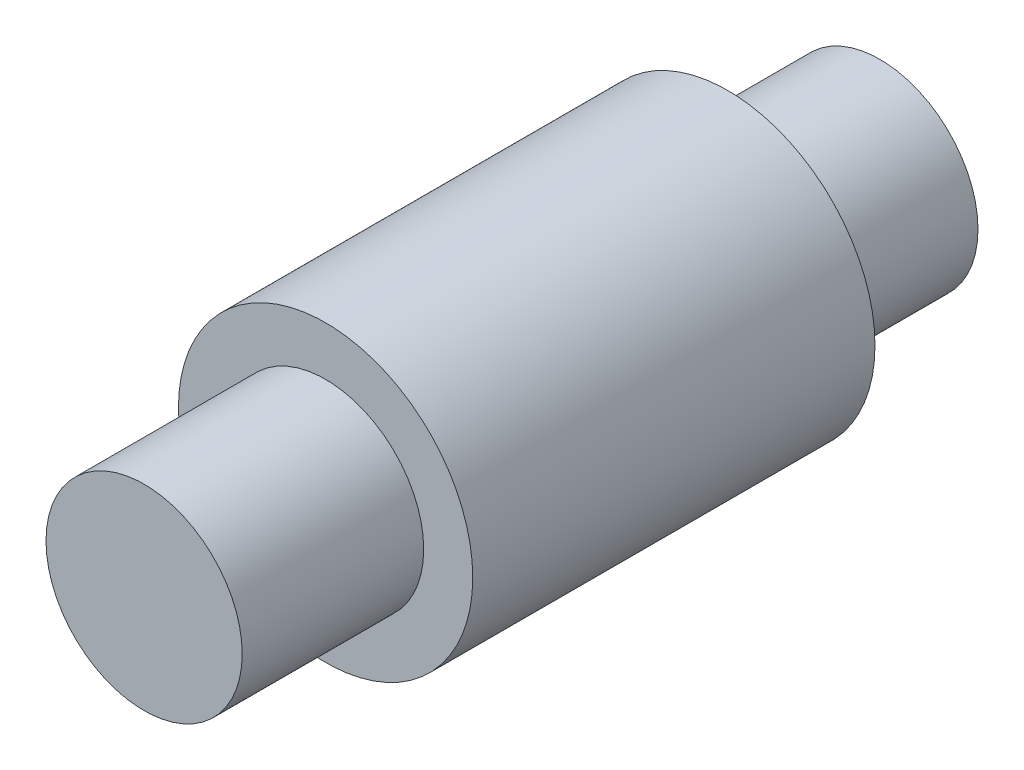
ISO-10303-21;
HEADER;
FILE_DESCRIPTION(('STEP AP214'),'2;1');
FILE_NAME('part.step','',(''),(''),'','','');
FILE_SCHEMA(('AUTOMOTIVE_DESIGN { 1 0 10303 214 1 1 1 1 }'));
ENDSEC;
DATA;
#1=APPLICATION_CONTEXT('core data for automotive mechanical design processes');
#2=APPLICATION_PROTOCOL_DEFINITION('international standard','automotive_design',2000,#1);
#3=PRODUCT_CONTEXT('',#1,'mechanical');
#4=PRODUCT('Part','Part','',(#3));
#5=PRODUCT_RELATED_PRODUCT_CATEGORY('part','',(#4));
#6=PRODUCT_DEFINITION_FORMATION('','',#4);
#7=PRODUCT_DEFINITION_CONTEXT('part definition',#1,'design');
#8=PRODUCT_DEFINITION('design','',#6,#7);
#9=PRODUCT_DEFINITION_SHAPE('','',#8);
#10=(LENGTH_UNIT() NAMED_UNIT(*) SI_UNIT(.MILLI.,.METRE.));
#11=(NAMED_UNIT(*) PLANE_ANGLE_UNIT() SI_UNIT($,.RADIAN.));
#12=(NAMED_UNIT(*) SI_UNIT($,.STERADIAN.) SOLID_ANGLE_UNIT());
#13=UNCERTAINTY_MEASURE_WITH_UNIT(LENGTH_MEASURE(1.E-05),#10,'distance_accuracy_value','');
#14=(GEOMETRIC_REPRESENTATION_CONTEXT(3) GLOBAL_UNCERTAINTY_ASSIGNED_CONTEXT((#13)) GLOBAL_UNIT_ASSIGNED_CONTEXT((#10,
#11,#12)) REPRESENTATION_CONTEXT('',''));
#15=CARTESIAN_POINT('',(0.,0.,0.));
#16=DIRECTION('',(0.,0.,1.));
#17=DIRECTION('',(1.,0.,0.));
#18=AXIS2_PLACEMENT_3D('',#15,#16,#17);
#19=CARTESIAN_POINT('',(0.,0.,41.));
#20=DIRECTION('',(0.,0.,-1.));
#21=DIRECTION('',(-1.,0.,0.));
#22=AXIS2_PLACEMENT_3D('',#19,#20,#21);
#23=CYLINDRICAL_SURFACE('',#22,15.);
#24=CARTESIAN_POINT('',(0.,0.,41.));
#25=DIRECTION('',(0.,0.,1.));
#26=DIRECTION('',(1.,0.,0.));
#27=AXIS2_PLACEMENT_3D('',#24,#25,#26);
#28=CIRCLE('',#27,15.);
#29=CARTESIAN_POINT('',(15.,0.,41.));
#30=VERTEX_POINT('',#29);
#31=EDGE_CURVE('E44',#30,#30,#28,.T.);
#32=ORIENTED_EDGE('',*,*,#31,.F.);
#33=EDGE_LOOP('',(#32));
#34=FACE_BOUND('',#33,.T.);
#35=CARTESIAN_POINT('',(0.,0.,0.));
#36=DIRECTION('',(0.,0.,1.));
#37=DIRECTION('',(1.,0.,0.));
#38=AXIS2_PLACEMENT_3D('',#35,#36,#37);
#39=CIRCLE('',#38,15.);
#40=CARTESIAN_POINT('',(15.,0.,0.));
#41=VERTEX_POINT('',#40);
#42=EDGE_CURVE('E35',#41,#41,#39,.T.);
#43=ORIENTED_EDGE('',*,*,#42,.T.);
#44=EDGE_LOOP('',(#43));
#45=FACE_BOUND('',#44,.T.);
#46=ADVANCED_FACE('F32',(#34,#45),#23,.T.);
#47=CARTESIAN_POINT('',(0.,0.,41.));
#48=DIRECTION('',(0.,0.,1.));
#49=DIRECTION('',(1.,0.,0.));
#50=AXIS2_PLACEMENT_3D('',#47,#48,#49);
#51=PLANE('',#50);
#52=CARTESIAN_POINT('',(0.,0.,41.));
#53=DIRECTION('',(0.,0.,1.));
#54=DIRECTION('',(1.,0.,0.));
#55=AXIS2_PLACEMENT_3D('',#52,#53,#54);
#56=CIRCLE('',#55,10.);
#57=CARTESIAN_POINT('',(10.,0.,41.));
#58=VERTEX_POINT('',#57);
#59=EDGE_CURVE('E39',#58,#58,#56,.T.);
#60=ORIENTED_EDGE('',*,*,#59,.F.);
#61=EDGE_LOOP('',(#60));
#62=FACE_BOUND('',#61,.T.);
#63=ORIENTED_EDGE('',*,*,#31,.T.);
#64=EDGE_LOOP('',(#63));
#65=FACE_BOUND('',#64,.T.);
#66=ADVANCED_FACE('F78',(#62,#65),#51,.T.);
#67=CARTESIAN_POINT('',(0.,0.,0.));
#68=DIRECTION('',(0.,0.,1.));
#69=DIRECTION('',(1.,0.,0.));
#70=AXIS2_PLACEMENT_3D('',#67,#68,#69);
#71=PLANE('',#70);
#72=CARTESIAN_POINT('',(0.,0.,0.));
#73=DIRECTION('',(0.,0.,-1.));
#74=DIRECTION('',(-1.,0.,0.));
#75=AXIS2_PLACEMENT_3D('',#72,#73,#74);
#76=CIRCLE('',#75,10.);
#77=CARTESIAN_POINT('',(-10.,0.,0.));
#78=VERTEX_POINT('',#77);
#79=EDGE_CURVE('E10',#78,#78,#76,.T.);
#80=ORIENTED_EDGE('',*,*,#79,.F.);
#81=EDGE_LOOP('',(#80));
#82=FACE_BOUND('',#81,.T.);
#83=ORIENTED_EDGE('',*,*,#42,.F.);
#84=EDGE_LOOP('',(#83));
#85=FACE_BOUND('',#84,.T.);
#86=ADVANCED_FACE('F74',(#82,#85),#71,.F.);
#87=CARTESIAN_POINT('',(0.,0.,49.5));
#88=DIRECTION('',(0.,0.,-1.));
#89=DIRECTION('',(-1.,0.,0.));
#90=AXIS2_PLACEMENT_3D('',#87,#88,#89);
#91=CYLINDRICAL_SURFACE('',#90,10.);
#92=ORIENTED_EDGE('',*,*,#59,.T.);
#93=EDGE_LOOP('',(#92));
#94=FACE_BOUND('',#93,.T.);
#95=CARTESIAN_POINT('',(0.,0.,59.5));
#96=DIRECTION('',(0.,0.,1.));
#97=DIRECTION('',(1.,0.,0.));
#98=AXIS2_PLACEMENT_3D('',#95,#96,#97);
#99=CIRCLE('',#98,10.);
#100=CARTESIAN_POINT('',(10.,0.,59.5));
#101=VERTEX_POINT('',#100);
#102=EDGE_CURVE('E47',#101,#101,#99,.T.);
#103=ORIENTED_EDGE('',*,*,#102,.F.);
#104=EDGE_LOOP('',(#103));
#105=FACE_BOUND('',#104,.T.);
#106=ADVANCED_FACE('F67',(#94,#105),#91,.T.);
#107=CARTESIAN_POINT('',(0.,0.,-5.5));
#108=DIRECTION('',(0.,0.,1.));
#109=DIRECTION('',(1.,0.,0.));
#110=AXIS2_PLACEMENT_3D('',#107,#108,#109);
#111=CYLINDRICAL_SURFACE('',#110,10.);
#112=ORIENTED_EDGE('',*,*,#79,.T.);
#113=EDGE_LOOP('',(#112));
#114=FACE_BOUND('',#113,.T.);
#115=CARTESIAN_POINT('',(0.,0.,-15.5));
#116=DIRECTION('',(0.,0.,-1.));
#117=DIRECTION('',(-1.,0.,0.));
#118=AXIS2_PLACEMENT_3D('',#115,#116,#117);
#119=CIRCLE('',#118,10.);
#120=CARTESIAN_POINT('',(-10.,0.,-15.5));
#121=VERTEX_POINT('',#120);
#122=EDGE_CURVE('E56',#121,#121,#119,.T.);
#123=ORIENTED_EDGE('',*,*,#122,.F.);
#124=EDGE_LOOP('',(#123));
#125=FACE_BOUND('',#124,.T.);
#126=ADVANCED_FACE('F64',(#114,#125),#111,.T.);
#127=CARTESIAN_POINT('',(0.,0.,59.5));
#128=DIRECTION('',(0.,0.,1.));
#129=DIRECTION('',(1.,0.,0.));
#130=AXIS2_PLACEMENT_3D('',#127,#128,#129);
#131=PLANE('',#130);
#132=ORIENTED_EDGE('',*,*,#102,.T.);
#133=EDGE_LOOP('',(#132));
#134=FACE_BOUND('',#133,.T.);
#135=ADVANCED_FACE('F66',(#134),#131,.T.);
#136=CARTESIAN_POINT('',(0.,0.,-15.5));
#137=DIRECTION('',(0.,0.,-1.));
#138=DIRECTION('',(-1.,0.,0.));
#139=AXIS2_PLACEMENT_3D('',#136,#137,#138);
#140=PLANE('',#139);
#141=ORIENTED_EDGE('',*,*,#122,.T.);
#142=EDGE_LOOP('',(#141));
#143=FACE_BOUND('',#142,.T.);
#144=ADVANCED_FACE('F62',(#143),#140,.T.);
#145=CLOSED_SHELL('',(#46,#66,#86,#106,#126,#135,#144));
#146=MANIFOLD_SOLID_BREP('B2',#145);
#147=ADVANCED_BREP_SHAPE_REPRESENTATION('',(#18,#146),#14);
#148=SHAPE_DEFINITION_REPRESENTATION(#9,#147);
ENDSEC;
END-ISO-10303-21;
